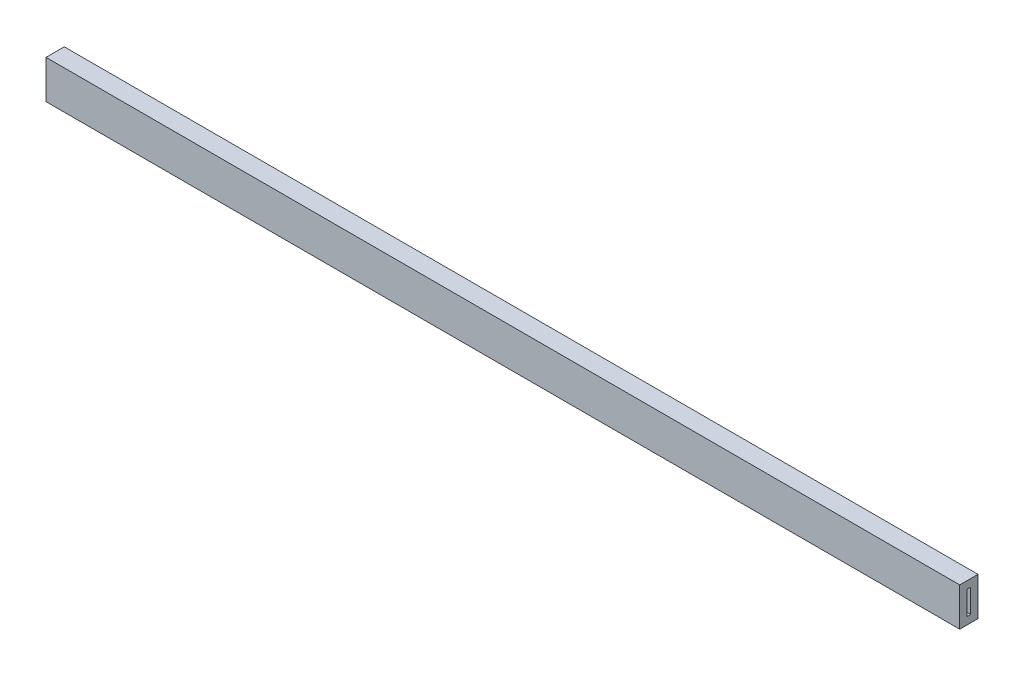
ISO-10303-21;
HEADER;
FILE_DESCRIPTION(('STEP AP214'),'2;1');
FILE_NAME('part.step','',(''),(''),'','','');
FILE_SCHEMA(('AUTOMOTIVE_DESIGN { 1 0 10303 214 1 1 1 1 }'));
ENDSEC;
DATA;
#1=APPLICATION_CONTEXT('core data for automotive mechanical design processes');
#2=APPLICATION_PROTOCOL_DEFINITION('international standard','automotive_design',2000,#1);
#3=PRODUCT_CONTEXT('',#1,'mechanical');
#4=PRODUCT('Part','Part','',(#3));
#5=PRODUCT_RELATED_PRODUCT_CATEGORY('part','',(#4));
#6=PRODUCT_DEFINITION_FORMATION('','',#4);
#7=PRODUCT_DEFINITION_CONTEXT('part definition',#1,'design');
#8=PRODUCT_DEFINITION('design','',#6,#7);
#9=PRODUCT_DEFINITION_SHAPE('','',#8);
#10=(LENGTH_UNIT() NAMED_UNIT(*) SI_UNIT(.MILLI.,.METRE.));
#11=(NAMED_UNIT(*) PLANE_ANGLE_UNIT() SI_UNIT($,.RADIAN.));
#12=(NAMED_UNIT(*) SI_UNIT($,.STERADIAN.) SOLID_ANGLE_UNIT());
#13=UNCERTAINTY_MEASURE_WITH_UNIT(LENGTH_MEASURE(1.E-05),#10,'distance_accuracy_value','');
#14=(GEOMETRIC_REPRESENTATION_CONTEXT(3) GLOBAL_UNCERTAINTY_ASSIGNED_CONTEXT((#13)) GLOBAL_UNIT_ASSIGNED_CONTEXT((#10,
#11,#12)) REPRESENTATION_CONTEXT('',''));
#15=CARTESIAN_POINT('',(0.,0.,0.));
#16=DIRECTION('',(0.,0.,1.));
#17=DIRECTION('',(1.,0.,0.));
#18=AXIS2_PLACEMENT_3D('',#15,#16,#17);
#19=CARTESIAN_POINT('',(750.,0.,0.));
#20=DIRECTION('',(-1.,0.,0.));
#21=DIRECTION('',(0.,0.,1.));
#22=AXIS2_PLACEMENT_3D('',#19,#20,#21);
#23=PLANE('',#22);
#24=DIRECTION('',(0.,1.,0.));
#25=VECTOR('',#24,1.);
#26=CARTESIAN_POINT('',(750.,-15.75,-7.5));
#27=LINE('',#26,#25);
#28=CARTESIAN_POINT('',(750.,-15.75,-7.5));
#29=VERTEX_POINT('',#28);
#30=CARTESIAN_POINT('',(750.,15.75,-7.5));
#31=VERTEX_POINT('',#30);
#32=EDGE_CURVE('E134',#29,#31,#27,.T.);
#33=ORIENTED_EDGE('',*,*,#32,.T.);
#34=DIRECTION('',(0.,0.,1.));
#35=VECTOR('',#34,1.);
#36=CARTESIAN_POINT('',(750.,15.75,7.5));
#37=LINE('',#36,#35);
#38=CARTESIAN_POINT('',(750.,15.75,7.5));
#39=VERTEX_POINT('',#38);
#40=EDGE_CURVE('E137',#31,#39,#37,.T.);
#41=ORIENTED_EDGE('',*,*,#40,.T.);
#42=DIRECTION('',(0.,-1.,0.));
#43=VECTOR('',#42,1.);
#44=CARTESIAN_POINT('',(750.,-15.75,7.5));
#45=LINE('',#44,#43);
#46=CARTESIAN_POINT('',(750.,-15.75,7.5));
#47=VERTEX_POINT('',#46);
#48=EDGE_CURVE('E140',#39,#47,#45,.T.);
#49=ORIENTED_EDGE('',*,*,#48,.T.);
#50=DIRECTION('',(0.,0.,-1.));
#51=VECTOR('',#50,1.);
#52=CARTESIAN_POINT('',(750.,-15.75,7.5));
#53=LINE('',#52,#51);
#54=EDGE_CURVE('E142',#47,#29,#53,.T.);
#55=ORIENTED_EDGE('',*,*,#54,.T.);
#56=EDGE_LOOP('',(#33,#41,#49,#55));
#57=FACE_BOUND('',#56,.T.);
#58=DIRECTION('',(0.,1.,0.));
#59=VECTOR('',#58,1.);
#60=CARTESIAN_POINT('',(750.,-9.74999999999999,-1.5));
#61=LINE('',#60,#59);
#62=CARTESIAN_POINT('',(750.,-9.74999999999999,-1.5));
#63=VERTEX_POINT('',#62);
#64=CARTESIAN_POINT('',(750.,9.75000000000001,-1.5));
#65=VERTEX_POINT('',#64);
#66=EDGE_CURVE('E98',#63,#65,#61,.T.);
#67=ORIENTED_EDGE('',*,*,#66,.F.);
#68=DIRECTION('',(0.,0.,-1.));
#69=VECTOR('',#68,1.);
#70=CARTESIAN_POINT('',(750.,-9.74999999999999,1.5));
#71=LINE('',#70,#69);
#72=CARTESIAN_POINT('',(750.,-9.74999999999999,1.5));
#73=VERTEX_POINT('',#72);
#74=EDGE_CURVE('E120',#73,#63,#71,.T.);
#75=ORIENTED_EDGE('',*,*,#74,.F.);
#76=DIRECTION('',(0.,-1.,0.));
#77=VECTOR('',#76,1.);
#78=CARTESIAN_POINT('',(750.,-9.74999999999999,1.5));
#79=LINE('',#78,#77);
#80=CARTESIAN_POINT('',(750.,9.75000000000001,1.5));
#81=VERTEX_POINT('',#80);
#82=EDGE_CURVE('E118',#81,#73,#79,.T.);
#83=ORIENTED_EDGE('',*,*,#82,.F.);
#84=DIRECTION('',(0.,0.,1.));
#85=VECTOR('',#84,1.);
#86=CARTESIAN_POINT('',(750.,9.75000000000001,1.5));
#87=LINE('',#86,#85);
#88=EDGE_CURVE('E106',#65,#81,#87,.T.);
#89=ORIENTED_EDGE('',*,*,#88,.F.);
#90=EDGE_LOOP('',(#67,#75,#83,#89));
#91=FACE_BOUND('',#90,.T.);
#92=ADVANCED_FACE('F33',(#57,#91),#23,.F.);
#93=CARTESIAN_POINT('',(0.,0.,0.));
#94=DIRECTION('',(-1.,0.,0.));
#95=DIRECTION('',(0.,0.,1.));
#96=AXIS2_PLACEMENT_3D('',#93,#94,#95);
#97=PLANE('',#96);
#98=DIRECTION('',(0.,1.,0.));
#99=VECTOR('',#98,1.);
#100=CARTESIAN_POINT('',(0.,-15.75,-7.5));
#101=LINE('',#100,#99);
#102=CARTESIAN_POINT('',(0.,-15.75,-7.5));
#103=VERTEX_POINT('',#102);
#104=CARTESIAN_POINT('',(0.,15.75,-7.5));
#105=VERTEX_POINT('',#104);
#106=EDGE_CURVE('E114',#103,#105,#101,.T.);
#107=ORIENTED_EDGE('',*,*,#106,.F.);
#108=DIRECTION('',(0.,0.,-1.));
#109=VECTOR('',#108,1.);
#110=CARTESIAN_POINT('',(0.,-15.75,7.5));
#111=LINE('',#110,#109);
#112=CARTESIAN_POINT('',(0.,-15.75,7.5));
#113=VERTEX_POINT('',#112);
#114=EDGE_CURVE('E138',#113,#103,#111,.T.);
#115=ORIENTED_EDGE('',*,*,#114,.F.);
#116=DIRECTION('',(0.,-1.,0.));
#117=VECTOR('',#116,1.);
#118=CARTESIAN_POINT('',(0.,-15.75,7.5));
#119=LINE('',#118,#117);
#120=CARTESIAN_POINT('',(0.,15.75,7.5));
#121=VERTEX_POINT('',#120);
#122=EDGE_CURVE('E149',#121,#113,#119,.T.);
#123=ORIENTED_EDGE('',*,*,#122,.F.);
#124=DIRECTION('',(0.,0.,1.));
#125=VECTOR('',#124,1.);
#126=CARTESIAN_POINT('',(0.,15.75,7.5));
#127=LINE('',#126,#125);
#128=EDGE_CURVE('E147',#105,#121,#127,.T.);
#129=ORIENTED_EDGE('',*,*,#128,.F.);
#130=EDGE_LOOP('',(#107,#115,#123,#129));
#131=FACE_BOUND('',#130,.T.);
#132=DIRECTION('',(0.,0.,-1.));
#133=VECTOR('',#132,1.);
#134=CARTESIAN_POINT('',(0.,-9.74999999999999,1.5));
#135=LINE('',#134,#133);
#136=CARTESIAN_POINT('',(0.,-9.74999999999999,1.5));
#137=VERTEX_POINT('',#136);
#138=CARTESIAN_POINT('',(0.,-9.74999999999999,-1.5));
#139=VERTEX_POINT('',#138);
#140=EDGE_CURVE('E107',#137,#139,#135,.T.);
#141=ORIENTED_EDGE('',*,*,#140,.T.);
#142=DIRECTION('',(0.,1.,0.));
#143=VECTOR('',#142,1.);
#144=CARTESIAN_POINT('',(0.,-9.74999999999999,-1.5));
#145=LINE('',#144,#143);
#146=CARTESIAN_POINT('',(0.,9.75000000000001,-1.5));
#147=VERTEX_POINT('',#146);
#148=EDGE_CURVE('E56',#139,#147,#145,.T.);
#149=ORIENTED_EDGE('',*,*,#148,.T.);
#150=DIRECTION('',(0.,0.,1.));
#151=VECTOR('',#150,1.);
#152=CARTESIAN_POINT('',(0.,9.75000000000001,1.5));
#153=LINE('',#152,#151);
#154=CARTESIAN_POINT('',(0.,9.75000000000001,1.5));
#155=VERTEX_POINT('',#154);
#156=EDGE_CURVE('E113',#147,#155,#153,.T.);
#157=ORIENTED_EDGE('',*,*,#156,.T.);
#158=DIRECTION('',(0.,-1.,0.));
#159=VECTOR('',#158,1.);
#160=CARTESIAN_POINT('',(0.,-9.74999999999999,1.5));
#161=LINE('',#160,#159);
#162=EDGE_CURVE('E126',#155,#137,#161,.T.);
#163=ORIENTED_EDGE('',*,*,#162,.T.);
#164=EDGE_LOOP('',(#141,#149,#157,#163));
#165=FACE_BOUND('',#164,.T.);
#166=ADVANCED_FACE('F167',(#131,#165),#97,.T.);
#167=CARTESIAN_POINT('',(750.,-15.75,-7.5));
#168=DIRECTION('',(0.,0.,1.));
#169=DIRECTION('',(1.,0.,0.));
#170=AXIS2_PLACEMENT_3D('',#167,#168,#169);
#171=PLANE('',#170);
#172=ORIENTED_EDGE('',*,*,#106,.T.);
#173=DIRECTION('',(-1.,0.,0.));
#174=VECTOR('',#173,1.);
#175=CARTESIAN_POINT('',(750.,15.75,-7.5));
#176=LINE('',#175,#174);
#177=EDGE_CURVE('E11',#31,#105,#176,.T.);
#178=ORIENTED_EDGE('',*,*,#177,.F.);
#179=ORIENTED_EDGE('',*,*,#32,.F.);
#180=DIRECTION('',(-1.,0.,0.));
#181=VECTOR('',#180,1.);
#182=CARTESIAN_POINT('',(750.,-15.75,-7.5));
#183=LINE('',#182,#181);
#184=EDGE_CURVE('E144',#29,#103,#183,.T.);
#185=ORIENTED_EDGE('',*,*,#184,.T.);
#186=EDGE_LOOP('',(#172,#178,#179,#185));
#187=FACE_BOUND('',#186,.T.);
#188=ADVANCED_FACE('F35',(#187),#171,.F.);
#189=CARTESIAN_POINT('',(750.,15.75,7.5));
#190=DIRECTION('',(0.,-1.,0.));
#191=DIRECTION('',(0.,0.,-1.));
#192=AXIS2_PLACEMENT_3D('',#189,#190,#191);
#193=PLANE('',#192);
#194=ORIENTED_EDGE('',*,*,#128,.T.);
#195=DIRECTION('',(-1.,0.,0.));
#196=VECTOR('',#195,1.);
#197=CARTESIAN_POINT('',(750.,15.75,7.5));
#198=LINE('',#197,#196);
#199=EDGE_CURVE('E41',#39,#121,#198,.T.);
#200=ORIENTED_EDGE('',*,*,#199,.F.);
#201=ORIENTED_EDGE('',*,*,#40,.F.);
#202=ORIENTED_EDGE('',*,*,#177,.T.);
#203=EDGE_LOOP('',(#194,#200,#201,#202));
#204=FACE_BOUND('',#203,.T.);
#205=ADVANCED_FACE('F177',(#204),#193,.F.);
#206=CARTESIAN_POINT('',(750.,-15.75,7.5));
#207=DIRECTION('',(0.,0.,-1.));
#208=DIRECTION('',(-1.,0.,0.));
#209=AXIS2_PLACEMENT_3D('',#206,#207,#208);
#210=PLANE('',#209);
#211=ORIENTED_EDGE('',*,*,#122,.T.);
#212=DIRECTION('',(-1.,0.,0.));
#213=VECTOR('',#212,1.);
#214=CARTESIAN_POINT('',(750.,-15.75,7.5));
#215=LINE('',#214,#213);
#216=EDGE_CURVE('E154',#47,#113,#215,.T.);
#217=ORIENTED_EDGE('',*,*,#216,.F.);
#218=ORIENTED_EDGE('',*,*,#48,.F.);
#219=ORIENTED_EDGE('',*,*,#199,.T.);
#220=EDGE_LOOP('',(#211,#217,#218,#219));
#221=FACE_BOUND('',#220,.T.);
#222=ADVANCED_FACE('F161',(#221),#210,.F.);
#223=CARTESIAN_POINT('',(750.,-15.75,7.5));
#224=DIRECTION('',(0.,1.,0.));
#225=DIRECTION('',(0.,0.,1.));
#226=AXIS2_PLACEMENT_3D('',#223,#224,#225);
#227=PLANE('',#226);
#228=ORIENTED_EDGE('',*,*,#114,.T.);
#229=ORIENTED_EDGE('',*,*,#184,.F.);
#230=ORIENTED_EDGE('',*,*,#54,.F.);
#231=ORIENTED_EDGE('',*,*,#216,.T.);
#232=EDGE_LOOP('',(#228,#229,#230,#231));
#233=FACE_BOUND('',#232,.T.);
#234=ADVANCED_FACE('F171',(#233),#227,.F.);
#235=CARTESIAN_POINT('',(750.,-9.74999999999999,-1.5));
#236=DIRECTION('',(0.,0.,1.));
#237=DIRECTION('',(1.,0.,0.));
#238=AXIS2_PLACEMENT_3D('',#235,#236,#237);
#239=PLANE('',#238);
#240=ORIENTED_EDGE('',*,*,#148,.F.);
#241=DIRECTION('',(-1.,0.,0.));
#242=VECTOR('',#241,1.);
#243=CARTESIAN_POINT('',(750.,-9.74999999999999,-1.5));
#244=LINE('',#243,#242);
#245=EDGE_CURVE('E102',#63,#139,#244,.T.);
#246=ORIENTED_EDGE('',*,*,#245,.F.);
#247=ORIENTED_EDGE('',*,*,#66,.T.);
#248=DIRECTION('',(-1.,0.,0.));
#249=VECTOR('',#248,1.);
#250=CARTESIAN_POINT('',(750.,9.75000000000001,-1.5));
#251=LINE('',#250,#249);
#252=EDGE_CURVE('E101',#65,#147,#251,.T.);
#253=ORIENTED_EDGE('',*,*,#252,.T.);
#254=EDGE_LOOP('',(#240,#246,#247,#253));
#255=FACE_BOUND('',#254,.T.);
#256=ADVANCED_FACE('F100',(#255),#239,.T.);
#257=CARTESIAN_POINT('',(750.,9.75000000000001,1.5));
#258=DIRECTION('',(0.,-1.,0.));
#259=DIRECTION('',(0.,0.,-1.));
#260=AXIS2_PLACEMENT_3D('',#257,#258,#259);
#261=PLANE('',#260);
#262=ORIENTED_EDGE('',*,*,#156,.F.);
#263=ORIENTED_EDGE('',*,*,#252,.F.);
#264=ORIENTED_EDGE('',*,*,#88,.T.);
#265=DIRECTION('',(-1.,0.,0.));
#266=VECTOR('',#265,1.);
#267=CARTESIAN_POINT('',(750.,9.75000000000001,1.5));
#268=LINE('',#267,#266);
#269=EDGE_CURVE('E115',#81,#155,#268,.T.);
#270=ORIENTED_EDGE('',*,*,#269,.T.);
#271=EDGE_LOOP('',(#262,#263,#264,#270));
#272=FACE_BOUND('',#271,.T.);
#273=ADVANCED_FACE('F110',(#272),#261,.T.);
#274=CARTESIAN_POINT('',(750.,-9.74999999999999,1.5));
#275=DIRECTION('',(0.,0.,-1.));
#276=DIRECTION('',(-1.,0.,0.));
#277=AXIS2_PLACEMENT_3D('',#274,#275,#276);
#278=PLANE('',#277);
#279=ORIENTED_EDGE('',*,*,#162,.F.);
#280=ORIENTED_EDGE('',*,*,#269,.F.);
#281=ORIENTED_EDGE('',*,*,#82,.T.);
#282=DIRECTION('',(-1.,0.,0.));
#283=VECTOR('',#282,1.);
#284=CARTESIAN_POINT('',(750.,-9.74999999999999,1.5));
#285=LINE('',#284,#283);
#286=EDGE_CURVE('E48',#73,#137,#285,.T.);
#287=ORIENTED_EDGE('',*,*,#286,.T.);
#288=EDGE_LOOP('',(#279,#280,#281,#287));
#289=FACE_BOUND('',#288,.T.);
#290=ADVANCED_FACE('F200',(#289),#278,.T.);
#291=CARTESIAN_POINT('',(750.,-9.74999999999999,1.5));
#292=DIRECTION('',(0.,1.,0.));
#293=DIRECTION('',(0.,0.,1.));
#294=AXIS2_PLACEMENT_3D('',#291,#292,#293);
#295=PLANE('',#294);
#296=ORIENTED_EDGE('',*,*,#140,.F.);
#297=ORIENTED_EDGE('',*,*,#286,.F.);
#298=ORIENTED_EDGE('',*,*,#74,.T.);
#299=ORIENTED_EDGE('',*,*,#245,.T.);
#300=EDGE_LOOP('',(#296,#297,#298,#299));
#301=FACE_BOUND('',#300,.T.);
#302=ADVANCED_FACE('F204',(#301),#295,.T.);
#303=CLOSED_SHELL('',(#92,#166,#188,#205,#222,#234,#256,#273,#290,#302));
#304=MANIFOLD_SOLID_BREP('B2',#303);
#305=ADVANCED_BREP_SHAPE_REPRESENTATION('',(#18,#304),#14);
#306=SHAPE_DEFINITION_REPRESENTATION(#9,#305);
ENDSEC;
END-ISO-10303-21;
